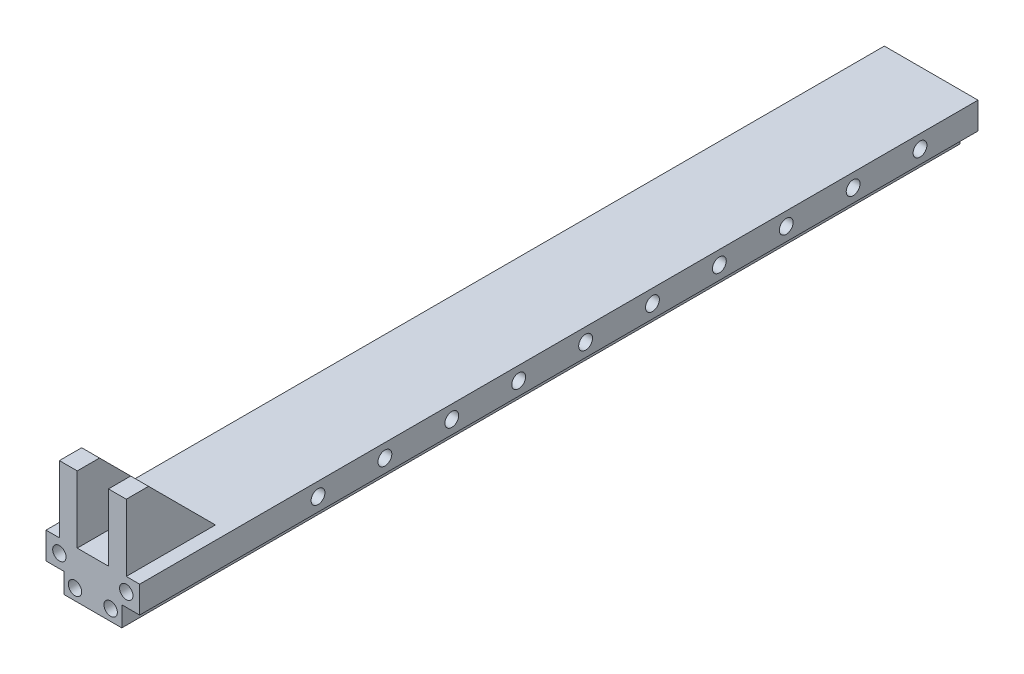
ISO-10303-21;
HEADER;
FILE_DESCRIPTION(('STEP AP214'),'2;1');
FILE_NAME('part.step','',(''),(''),'','','');
FILE_SCHEMA(('AUTOMOTIVE_DESIGN { 1 0 10303 214 1 1 1 1 }'));
ENDSEC;
DATA;
#1=APPLICATION_CONTEXT('core data for automotive mechanical design processes');
#2=APPLICATION_PROTOCOL_DEFINITION('international standard','automotive_design',2000,#1);
#3=PRODUCT_CONTEXT('',#1,'mechanical');
#4=PRODUCT('Part','Part','',(#3));
#5=PRODUCT_RELATED_PRODUCT_CATEGORY('part','',(#4));
#6=PRODUCT_DEFINITION_FORMATION('','',#4);
#7=PRODUCT_DEFINITION_CONTEXT('part definition',#1,'design');
#8=PRODUCT_DEFINITION('design','',#6,#7);
#9=PRODUCT_DEFINITION_SHAPE('','',#8);
#10=(LENGTH_UNIT() NAMED_UNIT(*) SI_UNIT(.MILLI.,.METRE.));
#11=(NAMED_UNIT(*) PLANE_ANGLE_UNIT() SI_UNIT($,.RADIAN.));
#12=(NAMED_UNIT(*) SI_UNIT($,.STERADIAN.) SOLID_ANGLE_UNIT());
#13=UNCERTAINTY_MEASURE_WITH_UNIT(LENGTH_MEASURE(1.E-05),#10,'distance_accuracy_value','');
#14=(GEOMETRIC_REPRESENTATION_CONTEXT(3) GLOBAL_UNCERTAINTY_ASSIGNED_CONTEXT((#13)) GLOBAL_UNIT_ASSIGNED_CONTEXT((#10,
#11,#12)) REPRESENTATION_CONTEXT('',''));
#15=CARTESIAN_POINT('',(0.,0.,0.));
#16=DIRECTION('',(0.,0.,1.));
#17=DIRECTION('',(1.,0.,0.));
#18=AXIS2_PLACEMENT_3D('',#15,#16,#17);
#19=CARTESIAN_POINT('',(583.100046396,788.400953309,220.));
#20=DIRECTION('',(0.,-0.707106781188048,0.707106781185048));
#21=DIRECTION('',(-1.,0.,0.));
#22=AXIS2_PLACEMENT_3D('',#19,#20,#21);
#23=PLANE('',#22);
#24=DIRECTION('',(0.,0.707106781185048,0.707106781188048));
#25=VECTOR('',#24,1.);
#26=CARTESIAN_POINT('',(576.100046396,780.900953309,212.5));
#27=LINE('',#26,#25);
#28=CARTESIAN_POINT('',(576.100046396,773.400953309,205.));
#29=VERTEX_POINT('',#28);
#30=CARTESIAN_POINT('',(576.100046396,788.400953309,220.));
#31=VERTEX_POINT('',#30);
#32=EDGE_CURVE('E205',#29,#31,#27,.T.);
#33=ORIENTED_EDGE('',*,*,#32,.F.);
#34=DIRECTION('',(-1.,0.,0.));
#35=VECTOR('',#34,1.);
#36=CARTESIAN_POINT('',(574.100046396,773.400953309,205.));
#37=LINE('',#36,#35);
#38=CARTESIAN_POINT('',(572.100046396,773.400953309,205.));
#39=VERTEX_POINT('',#38);
#40=EDGE_CURVE('E170',#29,#39,#37,.T.);
#41=ORIENTED_EDGE('',*,*,#40,.T.);
#42=DIRECTION('',(0.,0.707106781185048,0.707106781188048));
#43=VECTOR('',#42,1.);
#44=CARTESIAN_POINT('',(572.100046396,780.900953309,212.5));
#45=LINE('',#44,#43);
#46=CARTESIAN_POINT('',(572.100046396,788.400953309,220.));
#47=VERTEX_POINT('',#46);
#48=EDGE_CURVE('E11',#39,#47,#45,.T.);
#49=ORIENTED_EDGE('',*,*,#48,.T.);
#50=DIRECTION('',(1.,0.,0.));
#51=VECTOR('',#50,1.);
#52=CARTESIAN_POINT('',(574.100046396,788.400953309,220.));
#53=LINE('',#52,#51);
#54=EDGE_CURVE('E26',#47,#31,#53,.T.);
#55=ORIENTED_EDGE('',*,*,#54,.T.);
#56=EDGE_LOOP('',(#33,#41,#49,#55));
#57=FACE_BOUND('',#56,.T.);
#58=ADVANCED_FACE('F17',(#57),#23,.F.);
#59=CARTESIAN_POINT('',(572.100046396,773.400953309,205.));
#60=DIRECTION('',(-1.,0.,0.));
#61=DIRECTION('',(0.,0.,1.));
#62=AXIS2_PLACEMENT_3D('',#59,#60,#61);
#63=PLANE('',#62);
#64=DIRECTION('',(0.,0.,1.));
#65=VECTOR('',#64,1.);
#66=CARTESIAN_POINT('',(572.100046396,773.400953309,215.));
#67=LINE('',#66,#65);
#68=CARTESIAN_POINT('',(572.100046396,773.400953309,225.));
#69=VERTEX_POINT('',#68);
#70=EDGE_CURVE('E118',#39,#69,#67,.T.);
#71=ORIENTED_EDGE('',*,*,#70,.T.);
#72=DIRECTION('',(0.,1.,0.));
#73=VECTOR('',#72,1.);
#74=CARTESIAN_POINT('',(572.100046396,780.900953309,225.));
#75=LINE('',#74,#73);
#76=CARTESIAN_POINT('',(572.100046396,788.400953309,225.));
#77=VERTEX_POINT('',#76);
#78=EDGE_CURVE('E241',#69,#77,#75,.T.);
#79=ORIENTED_EDGE('',*,*,#78,.T.);
#80=DIRECTION('',(0.,0.,1.));
#81=VECTOR('',#80,1.);
#82=CARTESIAN_POINT('',(572.100046396,788.400953309,222.5));
#83=LINE('',#82,#81);
#84=EDGE_CURVE('E209',#47,#77,#83,.T.);
#85=ORIENTED_EDGE('',*,*,#84,.F.);
#86=ORIENTED_EDGE('',*,*,#48,.F.);
#87=EDGE_LOOP('',(#71,#79,#85,#86));
#88=FACE_BOUND('',#87,.T.);
#89=ADVANCED_FACE('F513',(#88),#63,.T.);
#90=CARTESIAN_POINT('',(0.,788.400953309,0.));
#91=DIRECTION('',(0.,1.,0.));
#92=DIRECTION('',(0.,0.,-1.));
#93=AXIS2_PLACEMENT_3D('',#90,#91,#92);
#94=PLANE('',#93);
#95=ORIENTED_EDGE('',*,*,#84,.T.);
#96=DIRECTION('',(1.,0.,0.));
#97=VECTOR('',#96,1.);
#98=CARTESIAN_POINT('',(574.100046396,788.400953309,225.));
#99=LINE('',#98,#97);
#100=CARTESIAN_POINT('',(576.100046396,788.400953309,225.));
#101=VERTEX_POINT('',#100);
#102=EDGE_CURVE('E236',#77,#101,#99,.T.);
#103=ORIENTED_EDGE('',*,*,#102,.T.);
#104=DIRECTION('',(0.,0.,-1.));
#105=VECTOR('',#104,1.);
#106=CARTESIAN_POINT('',(576.100046396,788.400953309,222.5));
#107=LINE('',#106,#105);
#108=EDGE_CURVE('E201',#101,#31,#107,.T.);
#109=ORIENTED_EDGE('',*,*,#108,.T.);
#110=ORIENTED_EDGE('',*,*,#54,.F.);
#111=EDGE_LOOP('',(#95,#103,#109,#110));
#112=FACE_BOUND('',#111,.T.);
#113=ADVANCED_FACE('F503',(#112),#94,.T.);
#114=CARTESIAN_POINT('',(576.100046396,773.400953309,225.));
#115=DIRECTION('',(1.,0.,0.));
#116=DIRECTION('',(0.,1.,0.));
#117=AXIS2_PLACEMENT_3D('',#114,#115,#116);
#118=PLANE('',#117);
#119=ORIENTED_EDGE('',*,*,#108,.F.);
#120=DIRECTION('',(0.,1.,0.));
#121=VECTOR('',#120,1.);
#122=CARTESIAN_POINT('',(576.100046396,780.900953309,225.));
#123=LINE('',#122,#121);
#124=CARTESIAN_POINT('',(576.100046396,773.400953309,225.));
#125=VERTEX_POINT('',#124);
#126=EDGE_CURVE('E232',#125,#101,#123,.T.);
#127=ORIENTED_EDGE('',*,*,#126,.F.);
#128=DIRECTION('',(0.,0.,-1.));
#129=VECTOR('',#128,1.);
#130=CARTESIAN_POINT('',(576.100046396,773.400953309,215.));
#131=LINE('',#130,#129);
#132=EDGE_CURVE('E206',#125,#29,#131,.T.);
#133=ORIENTED_EDGE('',*,*,#132,.T.);
#134=ORIENTED_EDGE('',*,*,#32,.T.);
#135=EDGE_LOOP('',(#119,#127,#133,#134));
#136=FACE_BOUND('',#135,.T.);
#137=ADVANCED_FACE('F508',(#136),#118,.T.);
#138=CARTESIAN_POINT('',(569.100046396,773.400953309,225.));
#139=DIRECTION('',(0.,1.,0.));
#140=DIRECTION('',(0.,0.,-1.));
#141=AXIS2_PLACEMENT_3D('',#138,#139,#140);
#142=PLANE('',#141);
#143=DIRECTION('',(0.,0.,-1.));
#144=VECTOR('',#143,1.);
#145=CARTESIAN_POINT('',(587.100046396,773.400953309,215.));
#146=LINE('',#145,#144);
#147=CARTESIAN_POINT('',(587.100046396,773.400953309,225.));
#148=VERTEX_POINT('',#147);
#149=CARTESIAN_POINT('',(587.100046396,773.400953309,205.));
#150=VERTEX_POINT('',#149);
#151=EDGE_CURVE('E183',#148,#150,#146,.T.);
#152=ORIENTED_EDGE('',*,*,#151,.F.);
#153=DIRECTION('',(-1.,0.,0.));
#154=VECTOR('',#153,1.);
#155=CARTESIAN_POINT('',(588.600046396,773.400953309,225.));
#156=LINE('',#155,#154);
#157=CARTESIAN_POINT('',(590.100046396,773.400953309,225.));
#158=VERTEX_POINT('',#157);
#159=EDGE_CURVE('E126',#158,#148,#156,.T.);
#160=ORIENTED_EDGE('',*,*,#159,.F.);
#161=DIRECTION('',(0.,0.,-1.));
#162=VECTOR('',#161,1.);
#163=CARTESIAN_POINT('',(590.100046396,773.400953309,131.));
#164=LINE('',#163,#162);
#165=CARTESIAN_POINT('',(590.100046396,773.400953309,37.));
#166=VERTEX_POINT('',#165);
#167=EDGE_CURVE('E122',#158,#166,#164,.T.);
#168=ORIENTED_EDGE('',*,*,#167,.T.);
#169=DIRECTION('',(-1.,0.,0.));
#170=VECTOR('',#169,1.);
#171=CARTESIAN_POINT('',(579.600046396,773.400953309,37.));
#172=LINE('',#171,#170);
#173=CARTESIAN_POINT('',(569.100046396,773.400953309,37.));
#174=VERTEX_POINT('',#173);
#175=EDGE_CURVE('E109',#166,#174,#172,.T.);
#176=ORIENTED_EDGE('',*,*,#175,.T.);
#177=DIRECTION('',(0.,0.,-1.));
#178=VECTOR('',#177,1.);
#179=CARTESIAN_POINT('',(569.100046396,773.400953309,131.));
#180=LINE('',#179,#178);
#181=CARTESIAN_POINT('',(569.100046396,773.400953309,225.));
#182=VERTEX_POINT('',#181);
#183=EDGE_CURVE('E312',#182,#174,#180,.T.);
#184=ORIENTED_EDGE('',*,*,#183,.F.);
#185=DIRECTION('',(-1.,0.,0.));
#186=VECTOR('',#185,1.);
#187=CARTESIAN_POINT('',(570.600046396,773.400953309,225.));
#188=LINE('',#187,#186);
#189=EDGE_CURVE('E244',#69,#182,#188,.T.);
#190=ORIENTED_EDGE('',*,*,#189,.F.);
#191=ORIENTED_EDGE('',*,*,#70,.F.);
#192=ORIENTED_EDGE('',*,*,#40,.F.);
#193=ORIENTED_EDGE('',*,*,#132,.F.);
#194=DIRECTION('',(-1.,0.,0.));
#195=VECTOR('',#194,1.);
#196=CARTESIAN_POINT('',(579.600046396,773.400953309,225.));
#197=LINE('',#196,#195);
#198=CARTESIAN_POINT('',(583.100046396,773.400953309,225.));
#199=VERTEX_POINT('',#198);
#200=EDGE_CURVE('E237',#199,#125,#197,.T.);
#201=ORIENTED_EDGE('',*,*,#200,.F.);
#202=DIRECTION('',(0.,0.,1.));
#203=VECTOR('',#202,1.);
#204=CARTESIAN_POINT('',(583.100046396,773.400953309,215.));
#205=LINE('',#204,#203);
#206=CARTESIAN_POINT('',(583.100046396,773.400953309,205.));
#207=VERTEX_POINT('',#206);
#208=EDGE_CURVE('E319',#207,#199,#205,.T.);
#209=ORIENTED_EDGE('',*,*,#208,.F.);
#210=DIRECTION('',(1.,0.,0.));
#211=VECTOR('',#210,1.);
#212=CARTESIAN_POINT('',(585.100046396,773.400953309,205.));
#213=LINE('',#212,#211);
#214=EDGE_CURVE('E459',#207,#150,#213,.T.);
#215=ORIENTED_EDGE('',*,*,#214,.T.);
#216=EDGE_LOOP('',(#152,#160,#168,#176,#184,#190,#191,#192,#193,#201,#209,#215));
#217=FACE_BOUND('',#216,.T.);
#218=ADVANCED_FACE('F124',(#217),#142,.T.);
#219=CARTESIAN_POINT('',(0.,0.,215.));
#220=DIRECTION('',(0.,0.,1.));
#221=DIRECTION('',(0.,-1.,0.));
#222=AXIS2_PLACEMENT_3D('',#219,#220,#221);
#223=PLANE('',#222);
#224=CARTESIAN_POINT('',(575.600046396,765.400953309,215.));
#225=DIRECTION('',(0.,0.,1.));
#226=DIRECTION('',(1.,0.,0.));
#227=AXIS2_PLACEMENT_3D('',#224,#225,#226);
#228=CIRCLE('',#227,1.5);
#229=CARTESIAN_POINT('',(577.100046396,765.400953309,215.));
#230=VERTEX_POINT('',#229);
#231=EDGE_CURVE('E119',#230,#230,#228,.T.);
#232=ORIENTED_EDGE('',*,*,#231,.T.);
#233=EDGE_LOOP('',(#232));
#234=FACE_BOUND('',#233,.T.);
#235=ADVANCED_FACE('F557',(#234),#223,.T.);
#236=CARTESIAN_POINT('',(0.,0.,215.));
#237=DIRECTION('',(0.,0.,1.));
#238=DIRECTION('',(0.,-1.,0.));
#239=AXIS2_PLACEMENT_3D('',#236,#237,#238);
#240=PLANE('',#239);
#241=CARTESIAN_POINT('',(587.100046396,770.400953309,215.));
#242=DIRECTION('',(0.,0.,1.));
#243=DIRECTION('',(1.,0.,0.));
#244=AXIS2_PLACEMENT_3D('',#241,#242,#243);
#245=CIRCLE('',#244,1.5);
#246=CARTESIAN_POINT('',(588.600046396,770.400953309,215.));
#247=VERTEX_POINT('',#246);
#248=EDGE_CURVE('E194',#247,#247,#245,.T.);
#249=ORIENTED_EDGE('',*,*,#248,.T.);
#250=EDGE_LOOP('',(#249));
#251=FACE_BOUND('',#250,.T.);
#252=ADVANCED_FACE('F558',(#251),#240,.T.);
#253=CARTESIAN_POINT('',(0.,0.,215.));
#254=DIRECTION('',(0.,0.,1.));
#255=DIRECTION('',(0.,-1.,0.));
#256=AXIS2_PLACEMENT_3D('',#253,#254,#255);
#257=PLANE('',#256);
#258=CARTESIAN_POINT('',(583.600046396,765.400953309,215.));
#259=DIRECTION('',(0.,0.,1.));
#260=DIRECTION('',(1.,0.,0.));
#261=AXIS2_PLACEMENT_3D('',#258,#259,#260);
#262=CIRCLE('',#261,1.5);
#263=CARTESIAN_POINT('',(585.100046396,765.400953309,215.));
#264=VERTEX_POINT('',#263);
#265=EDGE_CURVE('E190',#264,#264,#262,.T.);
#266=ORIENTED_EDGE('',*,*,#265,.T.);
#267=EDGE_LOOP('',(#266));
#268=FACE_BOUND('',#267,.T.);
#269=ADVANCED_FACE('F553',(#268),#257,.T.);
#270=CARTESIAN_POINT('',(663.100046396,770.400953309,185.));
#271=DIRECTION('',(-1.,0.,0.));
#272=DIRECTION('',(0.,-1.,0.));
#273=AXIS2_PLACEMENT_3D('',#270,#271,#272);
#274=CYLINDRICAL_SURFACE('',#273,1.55);
#275=CARTESIAN_POINT('',(590.100046396,770.400953309,185.));
#276=DIRECTION('',(-1.,0.,0.));
#277=DIRECTION('',(0.,-1.,0.));
#278=AXIS2_PLACEMENT_3D('',#275,#276,#277);
#279=CIRCLE('',#278,1.55);
#280=CARTESIAN_POINT('',(590.100046396,768.850953309,185.));
#281=VERTEX_POINT('',#280);
#282=EDGE_CURVE('E156',#281,#281,#279,.T.);
#283=ORIENTED_EDGE('',*,*,#282,.F.);
#284=EDGE_LOOP('',(#283));
#285=FACE_BOUND('',#284,.T.);
#286=CARTESIAN_POINT('',(569.100046396,770.400953309,185.));
#287=DIRECTION('',(-1.,0.,0.));
#288=DIRECTION('',(0.,1.,0.));
#289=AXIS2_PLACEMENT_3D('',#286,#287,#288);
#290=CIRCLE('',#289,1.55);
#291=CARTESIAN_POINT('',(569.100046396,771.950953309,185.));
#292=VERTEX_POINT('',#291);
#293=EDGE_CURVE('E297',#292,#292,#290,.T.);
#294=ORIENTED_EDGE('',*,*,#293,.T.);
#295=EDGE_LOOP('',(#294));
#296=FACE_BOUND('',#295,.T.);
#297=ADVANCED_FACE('F549',(#285,#296),#274,.F.);
#298=CARTESIAN_POINT('',(663.100046396,770.400953309,170.));
#299=DIRECTION('',(-1.,0.,0.));
#300=DIRECTION('',(0.,-1.,0.));
#301=AXIS2_PLACEMENT_3D('',#298,#299,#300);
#302=CYLINDRICAL_SURFACE('',#301,1.55);
#303=CARTESIAN_POINT('',(590.100046396,770.400953309,170.));
#304=DIRECTION('',(-1.,0.,0.));
#305=DIRECTION('',(0.,-1.,0.));
#306=AXIS2_PLACEMENT_3D('',#303,#304,#305);
#307=CIRCLE('',#306,1.55);
#308=CARTESIAN_POINT('',(590.100046396,768.850953309,170.));
#309=VERTEX_POINT('',#308);
#310=EDGE_CURVE('E152',#309,#309,#307,.T.);
#311=ORIENTED_EDGE('',*,*,#310,.F.);
#312=EDGE_LOOP('',(#311));
#313=FACE_BOUND('',#312,.T.);
#314=CARTESIAN_POINT('',(569.100046396,770.400953309,170.));
#315=DIRECTION('',(-1.,0.,0.));
#316=DIRECTION('',(0.,1.,0.));
#317=AXIS2_PLACEMENT_3D('',#314,#315,#316);
#318=CIRCLE('',#317,1.55);
#319=CARTESIAN_POINT('',(569.100046396,771.950953309,170.));
#320=VERTEX_POINT('',#319);
#321=EDGE_CURVE('E365',#320,#320,#318,.T.);
#322=ORIENTED_EDGE('',*,*,#321,.T.);
#323=EDGE_LOOP('',(#322));
#324=FACE_BOUND('',#323,.T.);
#325=ADVANCED_FACE('F545',(#313,#324),#302,.F.);
#326=CARTESIAN_POINT('',(663.100046396,770.400953309,155.));
#327=DIRECTION('',(-1.,0.,0.));
#328=DIRECTION('',(0.,-1.,0.));
#329=AXIS2_PLACEMENT_3D('',#326,#327,#328);
#330=CYLINDRICAL_SURFACE('',#329,1.55);
#331=CARTESIAN_POINT('',(590.100046396,770.400953309,155.));
#332=DIRECTION('',(-1.,0.,0.));
#333=DIRECTION('',(0.,-1.,0.));
#334=AXIS2_PLACEMENT_3D('',#331,#332,#333);
#335=CIRCLE('',#334,1.55);
#336=CARTESIAN_POINT('',(590.100046396,768.850953309,155.));
#337=VERTEX_POINT('',#336);
#338=EDGE_CURVE('E157',#337,#337,#335,.T.);
#339=ORIENTED_EDGE('',*,*,#338,.F.);
#340=EDGE_LOOP('',(#339));
#341=FACE_BOUND('',#340,.T.);
#342=CARTESIAN_POINT('',(569.100046396,770.400953309,155.));
#343=DIRECTION('',(-1.,0.,0.));
#344=DIRECTION('',(0.,1.,0.));
#345=AXIS2_PLACEMENT_3D('',#342,#343,#344);
#346=CIRCLE('',#345,1.55);
#347=CARTESIAN_POINT('',(569.100046396,771.950953309,155.));
#348=VERTEX_POINT('',#347);
#349=EDGE_CURVE('E361',#348,#348,#346,.T.);
#350=ORIENTED_EDGE('',*,*,#349,.T.);
#351=EDGE_LOOP('',(#350));
#352=FACE_BOUND('',#351,.T.);
#353=ADVANCED_FACE('F548',(#341,#352),#330,.F.);
#354=CARTESIAN_POINT('',(663.100046396,770.400953309,140.));
#355=DIRECTION('',(-1.,0.,0.));
#356=DIRECTION('',(0.,-1.,0.));
#357=AXIS2_PLACEMENT_3D('',#354,#355,#356);
#358=CYLINDRICAL_SURFACE('',#357,1.55);
#359=CARTESIAN_POINT('',(590.100046396,770.400953309,140.));
#360=DIRECTION('',(-1.,0.,0.));
#361=DIRECTION('',(0.,-1.,0.));
#362=AXIS2_PLACEMENT_3D('',#359,#360,#361);
#363=CIRCLE('',#362,1.55);
#364=CARTESIAN_POINT('',(590.100046396,768.850953309,140.));
#365=VERTEX_POINT('',#364);
#366=EDGE_CURVE('E175',#365,#365,#363,.T.);
#367=ORIENTED_EDGE('',*,*,#366,.F.);
#368=EDGE_LOOP('',(#367));
#369=FACE_BOUND('',#368,.T.);
#370=CARTESIAN_POINT('',(569.100046396,770.400953309,140.));
#371=DIRECTION('',(-1.,0.,0.));
#372=DIRECTION('',(0.,1.,0.));
#373=AXIS2_PLACEMENT_3D('',#370,#371,#372);
#374=CIRCLE('',#373,1.55);
#375=CARTESIAN_POINT('',(569.100046396,771.950953309,140.));
#376=VERTEX_POINT('',#375);
#377=EDGE_CURVE('E355',#376,#376,#374,.T.);
#378=ORIENTED_EDGE('',*,*,#377,.T.);
#379=EDGE_LOOP('',(#378));
#380=FACE_BOUND('',#379,.T.);
#381=ADVANCED_FACE('F543',(#369,#380),#358,.F.);
#382=CARTESIAN_POINT('',(663.100046396,770.400953309,125.));
#383=DIRECTION('',(-1.,0.,0.));
#384=DIRECTION('',(0.,-1.,0.));
#385=AXIS2_PLACEMENT_3D('',#382,#383,#384);
#386=CYLINDRICAL_SURFACE('',#385,1.55);
#387=CARTESIAN_POINT('',(590.100046396,770.400953309,125.));
#388=DIRECTION('',(-1.,0.,0.));
#389=DIRECTION('',(0.,-1.,0.));
#390=AXIS2_PLACEMENT_3D('',#387,#388,#389);
#391=CIRCLE('',#390,1.55);
#392=CARTESIAN_POINT('',(590.100046396,768.850953309,125.));
#393=VERTEX_POINT('',#392);
#394=EDGE_CURVE('E171',#393,#393,#391,.T.);
#395=ORIENTED_EDGE('',*,*,#394,.F.);
#396=EDGE_LOOP('',(#395));
#397=FACE_BOUND('',#396,.T.);
#398=CARTESIAN_POINT('',(569.100046396,770.400953309,125.));
#399=DIRECTION('',(-1.,0.,0.));
#400=DIRECTION('',(0.,1.,0.));
#401=AXIS2_PLACEMENT_3D('',#398,#399,#400);
#402=CIRCLE('',#401,1.55);
#403=CARTESIAN_POINT('',(569.100046396,771.950953309,125.));
#404=VERTEX_POINT('',#403);
#405=EDGE_CURVE('E351',#404,#404,#402,.T.);
#406=ORIENTED_EDGE('',*,*,#405,.T.);
#407=EDGE_LOOP('',(#406));
#408=FACE_BOUND('',#407,.T.);
#409=ADVANCED_FACE('F620',(#397,#408),#386,.F.);
#410=CARTESIAN_POINT('',(663.100046396,770.400953309,110.));
#411=DIRECTION('',(-1.,0.,0.));
#412=DIRECTION('',(0.,-1.,0.));
#413=AXIS2_PLACEMENT_3D('',#410,#411,#412);
#414=CYLINDRICAL_SURFACE('',#413,1.55);
#415=CARTESIAN_POINT('',(590.100046396,770.400953309,110.));
#416=DIRECTION('',(-1.,0.,0.));
#417=DIRECTION('',(0.,-1.,0.));
#418=AXIS2_PLACEMENT_3D('',#415,#416,#417);
#419=CIRCLE('',#418,1.55);
#420=CARTESIAN_POINT('',(590.100046396,768.850953309,110.));
#421=VERTEX_POINT('',#420);
#422=EDGE_CURVE('E166',#421,#421,#419,.T.);
#423=ORIENTED_EDGE('',*,*,#422,.F.);
#424=EDGE_LOOP('',(#423));
#425=FACE_BOUND('',#424,.T.);
#426=CARTESIAN_POINT('',(569.100046396,770.400953309,110.));
#427=DIRECTION('',(-1.,0.,0.));
#428=DIRECTION('',(0.,1.,0.));
#429=AXIS2_PLACEMENT_3D('',#426,#427,#428);
#430=CIRCLE('',#429,1.55);
#431=CARTESIAN_POINT('',(569.100046396,771.950953309,110.));
#432=VERTEX_POINT('',#431);
#433=EDGE_CURVE('E331',#432,#432,#430,.T.);
#434=ORIENTED_EDGE('',*,*,#433,.T.);
#435=EDGE_LOOP('',(#434));
#436=FACE_BOUND('',#435,.T.);
#437=ADVANCED_FACE('F628',(#425,#436),#414,.F.);
#438=CARTESIAN_POINT('',(663.100046396,770.400953309,95.));
#439=DIRECTION('',(-1.,0.,0.));
#440=DIRECTION('',(0.,-1.,0.));
#441=AXIS2_PLACEMENT_3D('',#438,#439,#440);
#442=CYLINDRICAL_SURFACE('',#441,1.55);
#443=CARTESIAN_POINT('',(590.100046396,770.400953309,95.));
#444=DIRECTION('',(-1.,0.,0.));
#445=DIRECTION('',(0.,-1.,0.));
#446=AXIS2_PLACEMENT_3D('',#443,#444,#445);
#447=CIRCLE('',#446,1.55);
#448=CARTESIAN_POINT('',(590.100046396,768.850953309,95.));
#449=VERTEX_POINT('',#448);
#450=EDGE_CURVE('E162',#449,#449,#447,.T.);
#451=ORIENTED_EDGE('',*,*,#450,.F.);
#452=EDGE_LOOP('',(#451));
#453=FACE_BOUND('',#452,.T.);
#454=CARTESIAN_POINT('',(569.100046396,770.400953309,95.));
#455=DIRECTION('',(-1.,0.,0.));
#456=DIRECTION('',(0.,1.,0.));
#457=AXIS2_PLACEMENT_3D('',#454,#455,#456);
#458=CIRCLE('',#457,1.55);
#459=CARTESIAN_POINT('',(569.100046396,771.950953309,95.));
#460=VERTEX_POINT('',#459);
#461=EDGE_CURVE('E327',#460,#460,#458,.T.);
#462=ORIENTED_EDGE('',*,*,#461,.T.);
#463=EDGE_LOOP('',(#462));
#464=FACE_BOUND('',#463,.T.);
#465=ADVANCED_FACE('F636',(#453,#464),#442,.F.);
#466=CARTESIAN_POINT('',(663.100046396,770.400953309,80.));
#467=DIRECTION('',(-1.,0.,0.));
#468=DIRECTION('',(0.,-1.,0.));
#469=AXIS2_PLACEMENT_3D('',#466,#467,#468);
#470=CYLINDRICAL_SURFACE('',#469,1.55);
#471=CARTESIAN_POINT('',(590.100046396,770.400953309,80.));
#472=DIRECTION('',(-1.,0.,0.));
#473=DIRECTION('',(0.,-1.,0.));
#474=AXIS2_PLACEMENT_3D('',#471,#472,#473);
#475=CIRCLE('',#474,1.55);
#476=CARTESIAN_POINT('',(590.100046396,768.850953309,80.));
#477=VERTEX_POINT('',#476);
#478=EDGE_CURVE('E158',#477,#477,#475,.T.);
#479=ORIENTED_EDGE('',*,*,#478,.F.);
#480=EDGE_LOOP('',(#479));
#481=FACE_BOUND('',#480,.T.);
#482=CARTESIAN_POINT('',(569.100046396,770.400953309,80.));
#483=DIRECTION('',(-1.,0.,0.));
#484=DIRECTION('',(0.,1.,0.));
#485=AXIS2_PLACEMENT_3D('',#482,#483,#484);
#486=CIRCLE('',#485,1.55);
#487=CARTESIAN_POINT('',(569.100046396,771.950953309,80.));
#488=VERTEX_POINT('',#487);
#489=EDGE_CURVE('E306',#488,#488,#486,.T.);
#490=ORIENTED_EDGE('',*,*,#489,.T.);
#491=EDGE_LOOP('',(#490));
#492=FACE_BOUND('',#491,.T.);
#493=ADVANCED_FACE('F645',(#481,#492),#470,.F.);
#494=CARTESIAN_POINT('',(663.100046396,770.400953309,50.));
#495=DIRECTION('',(-1.,0.,0.));
#496=DIRECTION('',(0.,-1.,0.));
#497=AXIS2_PLACEMENT_3D('',#494,#495,#496);
#498=CYLINDRICAL_SURFACE('',#497,1.55);
#499=CARTESIAN_POINT('',(590.100046396,770.400953309,50.));
#500=DIRECTION('',(-1.,0.,0.));
#501=DIRECTION('',(0.,-1.,0.));
#502=AXIS2_PLACEMENT_3D('',#499,#500,#501);
#503=CIRCLE('',#502,1.55);
#504=CARTESIAN_POINT('',(590.100046396,768.850953309,50.));
#505=VERTEX_POINT('',#504);
#506=EDGE_CURVE('E151',#505,#505,#503,.T.);
#507=ORIENTED_EDGE('',*,*,#506,.F.);
#508=EDGE_LOOP('',(#507));
#509=FACE_BOUND('',#508,.T.);
#510=CARTESIAN_POINT('',(569.100046396,770.400953309,50.));
#511=DIRECTION('',(-1.,0.,0.));
#512=DIRECTION('',(0.,1.,0.));
#513=AXIS2_PLACEMENT_3D('',#510,#511,#512);
#514=CIRCLE('',#513,1.55);
#515=CARTESIAN_POINT('',(569.100046396,771.950953309,50.));
#516=VERTEX_POINT('',#515);
#517=EDGE_CURVE('E302',#516,#516,#514,.T.);
#518=ORIENTED_EDGE('',*,*,#517,.T.);
#519=EDGE_LOOP('',(#518));
#520=FACE_BOUND('',#519,.T.);
#521=ADVANCED_FACE('F654',(#509,#520),#498,.F.);
#522=CARTESIAN_POINT('',(663.100046396,770.400953309,65.));
#523=DIRECTION('',(-1.,0.,0.));
#524=DIRECTION('',(0.,-1.,0.));
#525=AXIS2_PLACEMENT_3D('',#522,#523,#524);
#526=CYLINDRICAL_SURFACE('',#525,1.55);
#527=CARTESIAN_POINT('',(590.100046396,770.400953309,65.));
#528=DIRECTION('',(-1.,0.,0.));
#529=DIRECTION('',(0.,-1.,0.));
#530=AXIS2_PLACEMENT_3D('',#527,#528,#529);
#531=CIRCLE('',#530,1.55);
#532=CARTESIAN_POINT('',(590.100046396,768.850953309,65.));
#533=VERTEX_POINT('',#532);
#534=EDGE_CURVE('E131',#533,#533,#531,.T.);
#535=ORIENTED_EDGE('',*,*,#534,.F.);
#536=EDGE_LOOP('',(#535));
#537=FACE_BOUND('',#536,.T.);
#538=CARTESIAN_POINT('',(569.100046396,770.400953309,65.));
#539=DIRECTION('',(-1.,0.,0.));
#540=DIRECTION('',(0.,1.,0.));
#541=AXIS2_PLACEMENT_3D('',#538,#539,#540);
#542=CIRCLE('',#541,1.55);
#543=CARTESIAN_POINT('',(569.100046396,771.950953309,65.));
#544=VERTEX_POINT('',#543);
#545=EDGE_CURVE('E307',#544,#544,#542,.T.);
#546=ORIENTED_EDGE('',*,*,#545,.T.);
#547=EDGE_LOOP('',(#546));
#548=FACE_BOUND('',#547,.T.);
#549=ADVANCED_FACE('F663',(#537,#548),#526,.F.);
#550=CARTESIAN_POINT('',(0.,0.,37.));
#551=DIRECTION('',(0.,0.,1.));
#552=DIRECTION('',(0.,-1.,0.));
#553=AXIS2_PLACEMENT_3D('',#550,#551,#552);
#554=PLANE('',#553);
#555=ORIENTED_EDGE('',*,*,#175,.F.);
#556=DIRECTION('',(0.,1.,0.));
#557=VECTOR('',#556,1.);
#558=CARTESIAN_POINT('',(590.100046396,770.400953309,37.));
#559=LINE('',#558,#557);
#560=CARTESIAN_POINT('',(590.100046396,767.400953309,37.));
#561=VERTEX_POINT('',#560);
#562=EDGE_CURVE('E104',#561,#166,#559,.T.);
#563=ORIENTED_EDGE('',*,*,#562,.F.);
#564=DIRECTION('',(1.,0.,0.));
#565=VECTOR('',#564,1.);
#566=CARTESIAN_POINT('',(588.100046396,767.400953309,37.));
#567=LINE('',#566,#565);
#568=CARTESIAN_POINT('',(586.100046396,767.400953309,37.));
#569=VERTEX_POINT('',#568);
#570=EDGE_CURVE('E142',#569,#561,#567,.T.);
#571=ORIENTED_EDGE('',*,*,#570,.F.);
#572=DIRECTION('',(0.,1.,0.));
#573=VECTOR('',#572,1.);
#574=CARTESIAN_POINT('',(586.100046396,765.150953309,37.));
#575=LINE('',#574,#573);
#576=CARTESIAN_POINT('',(586.100046396,762.900953309,37.));
#577=VERTEX_POINT('',#576);
#578=EDGE_CURVE('E146',#577,#569,#575,.T.);
#579=ORIENTED_EDGE('',*,*,#578,.F.);
#580=DIRECTION('',(1.,0.,0.));
#581=VECTOR('',#580,1.);
#582=CARTESIAN_POINT('',(579.600046396,762.900953309,37.));
#583=LINE('',#582,#581);
#584=CARTESIAN_POINT('',(573.100046396,762.900953309,37.));
#585=VERTEX_POINT('',#584);
#586=EDGE_CURVE('E339',#585,#577,#583,.T.);
#587=ORIENTED_EDGE('',*,*,#586,.F.);
#588=DIRECTION('',(0.,-1.,0.));
#589=VECTOR('',#588,1.);
#590=CARTESIAN_POINT('',(573.100046396,765.150953309,37.));
#591=LINE('',#590,#589);
#592=CARTESIAN_POINT('',(573.100046396,767.400953309,37.));
#593=VERTEX_POINT('',#592);
#594=EDGE_CURVE('E375',#593,#585,#591,.T.);
#595=ORIENTED_EDGE('',*,*,#594,.F.);
#596=DIRECTION('',(1.,0.,0.));
#597=VECTOR('',#596,1.);
#598=CARTESIAN_POINT('',(571.100046396,767.400953309,37.));
#599=LINE('',#598,#597);
#600=CARTESIAN_POINT('',(569.100046396,767.400953309,37.));
#601=VERTEX_POINT('',#600);
#602=EDGE_CURVE('E292',#601,#593,#599,.T.);
#603=ORIENTED_EDGE('',*,*,#602,.F.);
#604=DIRECTION('',(0.,-1.,0.));
#605=VECTOR('',#604,1.);
#606=CARTESIAN_POINT('',(569.100046396,770.400953309,37.));
#607=LINE('',#606,#605);
#608=EDGE_CURVE('E113',#174,#601,#607,.T.);
#609=ORIENTED_EDGE('',*,*,#608,.F.);
#610=EDGE_LOOP('',(#555,#563,#571,#579,#587,#595,#603,#609));
#611=FACE_BOUND('',#610,.T.);
#612=ADVANCED_FACE('F111',(#611),#554,.F.);
#613=CARTESIAN_POINT('',(575.600046396,765.400953309,220.));
#614=DIRECTION('',(0.,0.,1.));
#615=DIRECTION('',(1.,0.,0.));
#616=AXIS2_PLACEMENT_3D('',#613,#614,#615);
#617=CYLINDRICAL_SURFACE('',#616,1.5);
#618=ORIENTED_EDGE('',*,*,#231,.F.);
#619=EDGE_LOOP('',(#618));
#620=FACE_BOUND('',#619,.T.);
#621=CARTESIAN_POINT('',(575.600046396,765.400953309,225.));
#622=DIRECTION('',(0.,0.,1.));
#623=DIRECTION('',(1.,0.,0.));
#624=AXIS2_PLACEMENT_3D('',#621,#622,#623);
#625=CIRCLE('',#624,1.5);
#626=CARTESIAN_POINT('',(577.100046396,765.400953309,225.));
#627=VERTEX_POINT('',#626);
#628=EDGE_CURVE('E291',#627,#627,#625,.T.);
#629=ORIENTED_EDGE('',*,*,#628,.T.);
#630=EDGE_LOOP('',(#629));
#631=FACE_BOUND('',#630,.T.);
#632=ADVANCED_FACE('F680',(#620,#631),#617,.F.);
#633=CARTESIAN_POINT('',(587.100046396,770.400953309,220.));
#634=DIRECTION('',(0.,0.,1.));
#635=DIRECTION('',(1.,0.,0.));
#636=AXIS2_PLACEMENT_3D('',#633,#634,#635);
#637=CYLINDRICAL_SURFACE('',#636,1.5);
#638=ORIENTED_EDGE('',*,*,#248,.F.);
#639=EDGE_LOOP('',(#638));
#640=FACE_BOUND('',#639,.T.);
#641=CARTESIAN_POINT('',(587.100046396,770.400953309,225.));
#642=DIRECTION('',(0.,0.,1.));
#643=DIRECTION('',(1.,0.,0.));
#644=AXIS2_PLACEMENT_3D('',#641,#642,#643);
#645=CIRCLE('',#644,1.5);
#646=CARTESIAN_POINT('',(588.600046396,770.400953309,225.));
#647=VERTEX_POINT('',#646);
#648=EDGE_CURVE('E311',#647,#647,#645,.T.);
#649=ORIENTED_EDGE('',*,*,#648,.T.);
#650=EDGE_LOOP('',(#649));
#651=FACE_BOUND('',#650,.T.);
#652=ADVANCED_FACE('F688',(#640,#651),#637,.F.);
#653=CARTESIAN_POINT('',(583.600046396,765.400953309,220.));
#654=DIRECTION('',(0.,0.,1.));
#655=DIRECTION('',(1.,0.,0.));
#656=AXIS2_PLACEMENT_3D('',#653,#654,#655);
#657=CYLINDRICAL_SURFACE('',#656,1.5);
#658=ORIENTED_EDGE('',*,*,#265,.F.);
#659=EDGE_LOOP('',(#658));
#660=FACE_BOUND('',#659,.T.);
#661=CARTESIAN_POINT('',(583.600046396,765.400953309,225.));
#662=DIRECTION('',(0.,0.,1.));
#663=DIRECTION('',(1.,0.,0.));
#664=AXIS2_PLACEMENT_3D('',#661,#662,#663);
#665=CIRCLE('',#664,1.5);
#666=CARTESIAN_POINT('',(585.100046396,765.400953309,225.));
#667=VERTEX_POINT('',#666);
#668=EDGE_CURVE('E301',#667,#667,#665,.T.);
#669=ORIENTED_EDGE('',*,*,#668,.T.);
#670=EDGE_LOOP('',(#669));
#671=FACE_BOUND('',#670,.T.);
#672=ADVANCED_FACE('F697',(#660,#671),#657,.F.);
#673=CARTESIAN_POINT('',(0.,788.400953309,0.));
#674=DIRECTION('',(0.,1.,0.));
#675=DIRECTION('',(0.,0.,-1.));
#676=AXIS2_PLACEMENT_3D('',#673,#674,#675);
#677=PLANE('',#676);
#678=DIRECTION('',(0.,0.,1.));
#679=VECTOR('',#678,1.);
#680=CARTESIAN_POINT('',(583.100046396,788.400953309,222.5));
#681=LINE('',#680,#679);
#682=CARTESIAN_POINT('',(583.100046396,788.400953309,220.));
#683=VERTEX_POINT('',#682);
#684=CARTESIAN_POINT('',(583.100046396,788.400953309,225.));
#685=VERTEX_POINT('',#684);
#686=EDGE_CURVE('E326',#683,#685,#681,.T.);
#687=ORIENTED_EDGE('',*,*,#686,.T.);
#688=DIRECTION('',(1.,0.,0.));
#689=VECTOR('',#688,1.);
#690=CARTESIAN_POINT('',(585.100046396,788.400953309,225.));
#691=LINE('',#690,#689);
#692=CARTESIAN_POINT('',(587.100046396,788.400953309,225.));
#693=VERTEX_POINT('',#692);
#694=EDGE_CURVE('E287',#685,#693,#691,.T.);
#695=ORIENTED_EDGE('',*,*,#694,.T.);
#696=DIRECTION('',(0.,0.,-1.));
#697=VECTOR('',#696,1.);
#698=CARTESIAN_POINT('',(587.100046396,788.400953309,222.5));
#699=LINE('',#698,#697);
#700=CARTESIAN_POINT('',(587.100046396,788.400953309,220.));
#701=VERTEX_POINT('',#700);
#702=EDGE_CURVE('E179',#693,#701,#699,.T.);
#703=ORIENTED_EDGE('',*,*,#702,.T.);
#704=DIRECTION('',(1.,0.,0.));
#705=VECTOR('',#704,1.);
#706=CARTESIAN_POINT('',(585.100046396,788.400953309,220.));
#707=LINE('',#706,#705);
#708=EDGE_CURVE('E478',#683,#701,#707,.T.);
#709=ORIENTED_EDGE('',*,*,#708,.F.);
#710=EDGE_LOOP('',(#687,#695,#703,#709));
#711=FACE_BOUND('',#710,.T.);
#712=ADVANCED_FACE('F706',(#711),#677,.T.);
#713=CARTESIAN_POINT('',(587.100046396,773.400953309,225.));
#714=DIRECTION('',(1.,0.,0.));
#715=DIRECTION('',(0.,1.,0.));
#716=AXIS2_PLACEMENT_3D('',#713,#714,#715);
#717=PLANE('',#716);
#718=ORIENTED_EDGE('',*,*,#702,.F.);
#719=DIRECTION('',(0.,1.,0.));
#720=VECTOR('',#719,1.);
#721=CARTESIAN_POINT('',(587.100046396,780.900953309,225.));
#722=LINE('',#721,#720);
#723=EDGE_CURVE('E283',#148,#693,#722,.T.);
#724=ORIENTED_EDGE('',*,*,#723,.F.);
#725=ORIENTED_EDGE('',*,*,#151,.T.);
#726=DIRECTION('',(0.,0.707106781185048,0.707106781188048));
#727=VECTOR('',#726,1.);
#728=CARTESIAN_POINT('',(587.100046396,780.900953309,212.5));
#729=LINE('',#728,#727);
#730=EDGE_CURVE('E475',#150,#701,#729,.T.);
#731=ORIENTED_EDGE('',*,*,#730,.T.);
#732=EDGE_LOOP('',(#718,#724,#725,#731));
#733=FACE_BOUND('',#732,.T.);
#734=ADVANCED_FACE('F463',(#733),#717,.T.);
#735=CARTESIAN_POINT('',(590.100046396,767.400953309,225.));
#736=DIRECTION('',(-1.,0.,0.));
#737=DIRECTION('',(0.,0.,1.));
#738=AXIS2_PLACEMENT_3D('',#735,#736,#737);
#739=PLANE('',#738);
#740=ORIENTED_EDGE('',*,*,#282,.T.);
#741=EDGE_LOOP('',(#740));
#742=FACE_BOUND('',#741,.T.);
#743=ORIENTED_EDGE('',*,*,#310,.T.);
#744=EDGE_LOOP('',(#743));
#745=FACE_BOUND('',#744,.T.);
#746=ORIENTED_EDGE('',*,*,#338,.T.);
#747=EDGE_LOOP('',(#746));
#748=FACE_BOUND('',#747,.T.);
#749=ORIENTED_EDGE('',*,*,#366,.T.);
#750=EDGE_LOOP('',(#749));
#751=FACE_BOUND('',#750,.T.);
#752=ORIENTED_EDGE('',*,*,#394,.T.);
#753=EDGE_LOOP('',(#752));
#754=FACE_BOUND('',#753,.T.);
#755=ORIENTED_EDGE('',*,*,#422,.T.);
#756=EDGE_LOOP('',(#755));
#757=FACE_BOUND('',#756,.T.);
#758=ORIENTED_EDGE('',*,*,#450,.T.);
#759=EDGE_LOOP('',(#758));
#760=FACE_BOUND('',#759,.T.);
#761=ORIENTED_EDGE('',*,*,#478,.T.);
#762=EDGE_LOOP('',(#761));
#763=FACE_BOUND('',#762,.T.);
#764=ORIENTED_EDGE('',*,*,#506,.T.);
#765=EDGE_LOOP('',(#764));
#766=FACE_BOUND('',#765,.T.);
#767=ORIENTED_EDGE('',*,*,#534,.T.);
#768=EDGE_LOOP('',(#767));
#769=FACE_BOUND('',#768,.T.);
#770=ORIENTED_EDGE('',*,*,#562,.T.);
#771=ORIENTED_EDGE('',*,*,#167,.F.);
#772=DIRECTION('',(0.,1.,0.));
#773=VECTOR('',#772,1.);
#774=CARTESIAN_POINT('',(590.100046396,770.400953309,225.));
#775=LINE('',#774,#773);
#776=CARTESIAN_POINT('',(590.100046396,767.400953309,225.));
#777=VERTEX_POINT('',#776);
#778=EDGE_CURVE('E275',#777,#158,#775,.T.);
#779=ORIENTED_EDGE('',*,*,#778,.F.);
#780=DIRECTION('',(0.,0.,-1.));
#781=VECTOR('',#780,1.);
#782=CARTESIAN_POINT('',(590.100046396,767.400953309,131.));
#783=LINE('',#782,#781);
#784=EDGE_CURVE('E134',#777,#561,#783,.T.);
#785=ORIENTED_EDGE('',*,*,#784,.T.);
#786=EDGE_LOOP('',(#770,#771,#779,#785));
#787=FACE_BOUND('',#786,.T.);
#788=ADVANCED_FACE('F133',(#742,#745,#748,#751,#754,#757,#760,#763,#766,#769,#787),#739,.F.);
#789=CARTESIAN_POINT('',(573.100046396,767.400953309,225.));
#790=DIRECTION('',(0.,-1.,0.));
#791=DIRECTION('',(0.,0.,-1.));
#792=AXIS2_PLACEMENT_3D('',#789,#790,#791);
#793=PLANE('',#792);
#794=ORIENTED_EDGE('',*,*,#570,.T.);
#795=ORIENTED_EDGE('',*,*,#784,.F.);
#796=DIRECTION('',(1.,0.,0.));
#797=VECTOR('',#796,1.);
#798=CARTESIAN_POINT('',(588.100046396,767.400953309,225.));
#799=LINE('',#798,#797);
#800=CARTESIAN_POINT('',(586.100046396,767.400953309,225.));
#801=VERTEX_POINT('',#800);
#802=EDGE_CURVE('E271',#801,#777,#799,.T.);
#803=ORIENTED_EDGE('',*,*,#802,.F.);
#804=DIRECTION('',(0.,0.,-1.));
#805=VECTOR('',#804,1.);
#806=CARTESIAN_POINT('',(586.100046396,767.400953309,131.));
#807=LINE('',#806,#805);
#808=EDGE_CURVE('E397',#801,#569,#807,.T.);
#809=ORIENTED_EDGE('',*,*,#808,.T.);
#810=EDGE_LOOP('',(#794,#795,#803,#809));
#811=FACE_BOUND('',#810,.T.);
#812=ADVANCED_FACE('F466',(#811),#793,.T.);
#813=CARTESIAN_POINT('',(586.100046396,762.900953309,225.));
#814=DIRECTION('',(-1.,0.,0.));
#815=DIRECTION('',(0.,0.,1.));
#816=AXIS2_PLACEMENT_3D('',#813,#814,#815);
#817=PLANE('',#816);
#818=ORIENTED_EDGE('',*,*,#578,.T.);
#819=ORIENTED_EDGE('',*,*,#808,.F.);
#820=DIRECTION('',(0.,1.,0.));
#821=VECTOR('',#820,1.);
#822=CARTESIAN_POINT('',(586.100046396,765.150953309,225.));
#823=LINE('',#822,#821);
#824=CARTESIAN_POINT('',(586.100046396,762.900953309,225.));
#825=VERTEX_POINT('',#824);
#826=EDGE_CURVE('E266',#825,#801,#823,.T.);
#827=ORIENTED_EDGE('',*,*,#826,.F.);
#828=DIRECTION('',(0.,0.,-1.));
#829=VECTOR('',#828,1.);
#830=CARTESIAN_POINT('',(586.100046396,762.900953309,131.));
#831=LINE('',#830,#829);
#832=EDGE_CURVE('E335',#825,#577,#831,.T.);
#833=ORIENTED_EDGE('',*,*,#832,.T.);
#834=EDGE_LOOP('',(#818,#819,#827,#833));
#835=FACE_BOUND('',#834,.T.);
#836=ADVANCED_FACE('F398',(#835),#817,.F.);
#837=CARTESIAN_POINT('',(586.100046396,762.900953309,225.));
#838=DIRECTION('',(0.,-1.,0.));
#839=DIRECTION('',(0.,0.,-1.));
#840=AXIS2_PLACEMENT_3D('',#837,#838,#839);
#841=PLANE('',#840);
#842=ORIENTED_EDGE('',*,*,#586,.T.);
#843=ORIENTED_EDGE('',*,*,#832,.F.);
#844=DIRECTION('',(1.,0.,0.));
#845=VECTOR('',#844,1.);
#846=CARTESIAN_POINT('',(579.600046396,762.900953309,225.));
#847=LINE('',#846,#845);
#848=CARTESIAN_POINT('',(573.100046396,762.900953309,225.));
#849=VERTEX_POINT('',#848);
#850=EDGE_CURVE('E262',#849,#825,#847,.T.);
#851=ORIENTED_EDGE('',*,*,#850,.F.);
#852=DIRECTION('',(0.,0.,-1.));
#853=VECTOR('',#852,1.);
#854=CARTESIAN_POINT('',(573.100046396,762.900953309,131.));
#855=LINE('',#854,#853);
#856=EDGE_CURVE('E379',#849,#585,#855,.T.);
#857=ORIENTED_EDGE('',*,*,#856,.T.);
#858=EDGE_LOOP('',(#842,#843,#851,#857));
#859=FACE_BOUND('',#858,.T.);
#860=ADVANCED_FACE('F387',(#859),#841,.T.);
#861=CARTESIAN_POINT('',(573.100046396,767.400953309,225.));
#862=DIRECTION('',(1.,0.,0.));
#863=DIRECTION('',(0.,0.,1.));
#864=AXIS2_PLACEMENT_3D('',#861,#862,#863);
#865=PLANE('',#864);
#866=ORIENTED_EDGE('',*,*,#594,.T.);
#867=ORIENTED_EDGE('',*,*,#856,.F.);
#868=DIRECTION('',(0.,-1.,0.));
#869=VECTOR('',#868,1.);
#870=CARTESIAN_POINT('',(573.100046396,765.150953309,225.));
#871=LINE('',#870,#869);
#872=CARTESIAN_POINT('',(573.100046396,767.400953309,225.));
#873=VERTEX_POINT('',#872);
#874=EDGE_CURVE('E259',#873,#849,#871,.T.);
#875=ORIENTED_EDGE('',*,*,#874,.F.);
#876=DIRECTION('',(0.,0.,-1.));
#877=VECTOR('',#876,1.);
#878=CARTESIAN_POINT('',(573.100046396,767.400953309,131.));
#879=LINE('',#878,#877);
#880=EDGE_CURVE('E296',#873,#593,#879,.T.);
#881=ORIENTED_EDGE('',*,*,#880,.T.);
#882=EDGE_LOOP('',(#866,#867,#875,#881));
#883=FACE_BOUND('',#882,.T.);
#884=ADVANCED_FACE('F406',(#883),#865,.F.);
#885=CARTESIAN_POINT('',(573.100046396,767.400953309,225.));
#886=DIRECTION('',(0.,-1.,0.));
#887=DIRECTION('',(0.,0.,-1.));
#888=AXIS2_PLACEMENT_3D('',#885,#886,#887);
#889=PLANE('',#888);
#890=ORIENTED_EDGE('',*,*,#602,.T.);
#891=ORIENTED_EDGE('',*,*,#880,.F.);
#892=DIRECTION('',(1.,0.,0.));
#893=VECTOR('',#892,1.);
#894=CARTESIAN_POINT('',(571.100046396,767.400953309,225.));
#895=LINE('',#894,#893);
#896=CARTESIAN_POINT('',(569.100046396,767.400953309,225.));
#897=VERTEX_POINT('',#896);
#898=EDGE_CURVE('E255',#897,#873,#895,.T.);
#899=ORIENTED_EDGE('',*,*,#898,.F.);
#900=DIRECTION('',(0.,0.,-1.));
#901=VECTOR('',#900,1.);
#902=CARTESIAN_POINT('',(569.100046396,767.400953309,131.));
#903=LINE('',#902,#901);
#904=EDGE_CURVE('E315',#897,#601,#903,.T.);
#905=ORIENTED_EDGE('',*,*,#904,.T.);
#906=EDGE_LOOP('',(#890,#891,#899,#905));
#907=FACE_BOUND('',#906,.T.);
#908=ADVANCED_FACE('F517',(#907),#889,.T.);
#909=CARTESIAN_POINT('',(569.100046396,773.400953309,225.));
#910=DIRECTION('',(1.,0.,0.));
#911=DIRECTION('',(0.,0.,1.));
#912=AXIS2_PLACEMENT_3D('',#909,#910,#911);
#913=PLANE('',#912);
#914=ORIENTED_EDGE('',*,*,#293,.F.);
#915=EDGE_LOOP('',(#914));
#916=FACE_BOUND('',#915,.T.);
#917=ORIENTED_EDGE('',*,*,#321,.F.);
#918=EDGE_LOOP('',(#917));
#919=FACE_BOUND('',#918,.T.);
#920=ORIENTED_EDGE('',*,*,#349,.F.);
#921=EDGE_LOOP('',(#920));
#922=FACE_BOUND('',#921,.T.);
#923=ORIENTED_EDGE('',*,*,#377,.F.);
#924=EDGE_LOOP('',(#923));
#925=FACE_BOUND('',#924,.T.);
#926=ORIENTED_EDGE('',*,*,#405,.F.);
#927=EDGE_LOOP('',(#926));
#928=FACE_BOUND('',#927,.T.);
#929=ORIENTED_EDGE('',*,*,#433,.F.);
#930=EDGE_LOOP('',(#929));
#931=FACE_BOUND('',#930,.T.);
#932=ORIENTED_EDGE('',*,*,#461,.F.);
#933=EDGE_LOOP('',(#932));
#934=FACE_BOUND('',#933,.T.);
#935=ORIENTED_EDGE('',*,*,#489,.F.);
#936=EDGE_LOOP('',(#935));
#937=FACE_BOUND('',#936,.T.);
#938=ORIENTED_EDGE('',*,*,#517,.F.);
#939=EDGE_LOOP('',(#938));
#940=FACE_BOUND('',#939,.T.);
#941=ORIENTED_EDGE('',*,*,#545,.F.);
#942=EDGE_LOOP('',(#941));
#943=FACE_BOUND('',#942,.T.);
#944=ORIENTED_EDGE('',*,*,#608,.T.);
#945=ORIENTED_EDGE('',*,*,#904,.F.);
#946=DIRECTION('',(0.,-1.,0.));
#947=VECTOR('',#946,1.);
#948=CARTESIAN_POINT('',(569.100046396,770.400953309,225.));
#949=LINE('',#948,#947);
#950=EDGE_CURVE('E251',#182,#897,#949,.T.);
#951=ORIENTED_EDGE('',*,*,#950,.F.);
#952=ORIENTED_EDGE('',*,*,#183,.T.);
#953=EDGE_LOOP('',(#944,#945,#951,#952));
#954=FACE_BOUND('',#953,.T.);
#955=ADVANCED_FACE('F514',(#916,#919,#922,#925,#928,#931,#934,#937,#940,#943,#954),#913,.F.);
#956=CARTESIAN_POINT('',(583.100046396,773.400953309,205.));
#957=DIRECTION('',(-1.,0.,0.));
#958=DIRECTION('',(0.,0.,1.));
#959=AXIS2_PLACEMENT_3D('',#956,#957,#958);
#960=PLANE('',#959);
#961=ORIENTED_EDGE('',*,*,#208,.T.);
#962=DIRECTION('',(0.,1.,0.));
#963=VECTOR('',#962,1.);
#964=CARTESIAN_POINT('',(583.100046396,780.900953309,225.));
#965=LINE('',#964,#963);
#966=EDGE_CURVE('E230',#199,#685,#965,.T.);
#967=ORIENTED_EDGE('',*,*,#966,.T.);
#968=ORIENTED_EDGE('',*,*,#686,.F.);
#969=DIRECTION('',(0.,0.707106781185048,0.707106781188048));
#970=VECTOR('',#969,1.);
#971=CARTESIAN_POINT('',(583.100046396,780.900953309,212.5));
#972=LINE('',#971,#970);
#973=EDGE_CURVE('E482',#207,#683,#972,.T.);
#974=ORIENTED_EDGE('',*,*,#973,.F.);
#975=EDGE_LOOP('',(#961,#967,#968,#974));
#976=FACE_BOUND('',#975,.T.);
#977=ADVANCED_FACE('F516',(#976),#960,.T.);
#978=CARTESIAN_POINT('',(0.,0.,215.));
#979=DIRECTION('',(0.,0.,1.));
#980=DIRECTION('',(0.,-1.,0.));
#981=AXIS2_PLACEMENT_3D('',#978,#979,#980);
#982=PLANE('',#981);
#983=CARTESIAN_POINT('',(572.100046396,770.400953309,215.));
#984=DIRECTION('',(0.,0.,1.));
#985=DIRECTION('',(1.,0.,0.));
#986=AXIS2_PLACEMENT_3D('',#983,#984,#985);
#987=CIRCLE('',#986,1.5);
#988=CARTESIAN_POINT('',(573.600046396,770.400953309,215.));
#989=VERTEX_POINT('',#988);
#990=EDGE_CURVE('E226',#989,#989,#987,.T.);
#991=ORIENTED_EDGE('',*,*,#990,.T.);
#992=EDGE_LOOP('',(#991));
#993=FACE_BOUND('',#992,.T.);
#994=ADVANCED_FACE('F525',(#993),#982,.T.);
#995=CARTESIAN_POINT('',(0.,0.,225.));
#996=DIRECTION('',(0.,0.,1.));
#997=DIRECTION('',(0.,-1.,0.));
#998=AXIS2_PLACEMENT_3D('',#995,#996,#997);
#999=PLANE('',#998);
#1000=ORIENTED_EDGE('',*,*,#648,.F.);
#1001=EDGE_LOOP('',(#1000));
#1002=FACE_BOUND('',#1001,.T.);
#1003=CARTESIAN_POINT('',(572.100046396,770.400953309,225.));
#1004=DIRECTION('',(0.,0.,1.));
#1005=DIRECTION('',(1.,0.,0.));
#1006=AXIS2_PLACEMENT_3D('',#1003,#1004,#1005);
#1007=CIRCLE('',#1006,1.5);
#1008=CARTESIAN_POINT('',(573.600046396,770.400953309,225.));
#1009=VERTEX_POINT('',#1008);
#1010=EDGE_CURVE('E231',#1009,#1009,#1007,.T.);
#1011=ORIENTED_EDGE('',*,*,#1010,.F.);
#1012=EDGE_LOOP('',(#1011));
#1013=FACE_BOUND('',#1012,.T.);
#1014=ORIENTED_EDGE('',*,*,#668,.F.);
#1015=EDGE_LOOP('',(#1014));
#1016=FACE_BOUND('',#1015,.T.);
#1017=ORIENTED_EDGE('',*,*,#628,.F.);
#1018=EDGE_LOOP('',(#1017));
#1019=FACE_BOUND('',#1018,.T.);
#1020=ORIENTED_EDGE('',*,*,#966,.F.);
#1021=ORIENTED_EDGE('',*,*,#200,.T.);
#1022=ORIENTED_EDGE('',*,*,#126,.T.);
#1023=ORIENTED_EDGE('',*,*,#102,.F.);
#1024=ORIENTED_EDGE('',*,*,#78,.F.);
#1025=ORIENTED_EDGE('',*,*,#189,.T.);
#1026=ORIENTED_EDGE('',*,*,#950,.T.);
#1027=ORIENTED_EDGE('',*,*,#898,.T.);
#1028=ORIENTED_EDGE('',*,*,#874,.T.);
#1029=ORIENTED_EDGE('',*,*,#850,.T.);
#1030=ORIENTED_EDGE('',*,*,#826,.T.);
#1031=ORIENTED_EDGE('',*,*,#802,.T.);
#1032=ORIENTED_EDGE('',*,*,#778,.T.);
#1033=ORIENTED_EDGE('',*,*,#159,.T.);
#1034=ORIENTED_EDGE('',*,*,#723,.T.);
#1035=ORIENTED_EDGE('',*,*,#694,.F.);
#1036=EDGE_LOOP('',(#1020,#1021,#1022,#1023,#1024,#1025,#1026,#1027,#1028,#1029,#1030,#1031,
#1032,#1033,#1034,#1035));
#1037=FACE_BOUND('',#1036,.T.);
#1038=ADVANCED_FACE('F402',(#1002,#1013,#1016,#1019,#1037),#999,.T.);
#1039=CARTESIAN_POINT('',(572.100046396,770.400953309,220.));
#1040=DIRECTION('',(0.,0.,1.));
#1041=DIRECTION('',(1.,0.,0.));
#1042=AXIS2_PLACEMENT_3D('',#1039,#1040,#1041);
#1043=CYLINDRICAL_SURFACE('',#1042,1.5);
#1044=ORIENTED_EDGE('',*,*,#990,.F.);
#1045=EDGE_LOOP('',(#1044));
#1046=FACE_BOUND('',#1045,.T.);
#1047=ORIENTED_EDGE('',*,*,#1010,.T.);
#1048=EDGE_LOOP('',(#1047));
#1049=FACE_BOUND('',#1048,.T.);
#1050=ADVANCED_FACE('F799',(#1046,#1049),#1043,.F.);
#1051=CARTESIAN_POINT('',(583.100046396,788.400953309,220.));
#1052=DIRECTION('',(0.,-0.707106781188048,0.707106781185048));
#1053=DIRECTION('',(-1.,0.,0.));
#1054=AXIS2_PLACEMENT_3D('',#1051,#1052,#1053);
#1055=PLANE('',#1054);
#1056=ORIENTED_EDGE('',*,*,#730,.F.);
#1057=ORIENTED_EDGE('',*,*,#214,.F.);
#1058=ORIENTED_EDGE('',*,*,#973,.T.);
#1059=ORIENTED_EDGE('',*,*,#708,.T.);
#1060=EDGE_LOOP('',(#1056,#1057,#1058,#1059));
#1061=FACE_BOUND('',#1060,.T.);
#1062=ADVANCED_FACE('F811',(#1061),#1055,.F.);
#1063=CLOSED_SHELL('',(#58,#89,#113,#137,#218,#235,#252,#269,#297,#325,#353,#381,#409,#437,#465,
#493,#521,#549,#612,#632,#652,#672,#712,#734,#788,#812,#836,#860,#884,#908,#955,#977,#994,#1038,
#1050,#1062));
#1064=MANIFOLD_SOLID_BREP('B1',#1063);
#1065=ADVANCED_BREP_SHAPE_REPRESENTATION('',(#18,#1064),#14);
#1066=SHAPE_DEFINITION_REPRESENTATION(#9,#1065);
ENDSEC;
END-ISO-10303-21;
